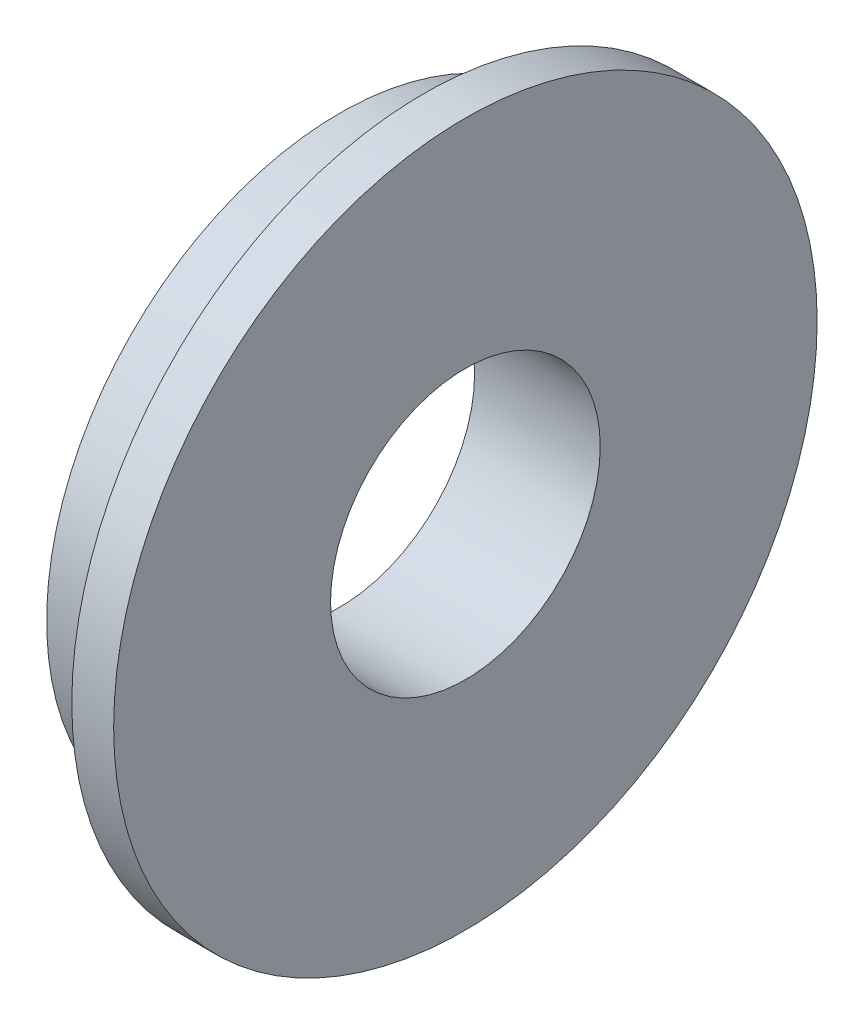
ISO-10303-21;
HEADER;
FILE_DESCRIPTION(('STEP AP214'),'2;1');
FILE_NAME('part.step','',(''),(''),'','','');
FILE_SCHEMA(('AUTOMOTIVE_DESIGN { 1 0 10303 214 1 1 1 1 }'));
ENDSEC;
DATA;
#1=APPLICATION_CONTEXT('core data for automotive mechanical design processes');
#2=APPLICATION_PROTOCOL_DEFINITION('international standard','automotive_design',2000,#1);
#3=PRODUCT_CONTEXT('',#1,'mechanical');
#4=PRODUCT('Part','Part','',(#3));
#5=PRODUCT_RELATED_PRODUCT_CATEGORY('part','',(#4));
#6=PRODUCT_DEFINITION_FORMATION('','',#4);
#7=PRODUCT_DEFINITION_CONTEXT('part definition',#1,'design');
#8=PRODUCT_DEFINITION('design','',#6,#7);
#9=PRODUCT_DEFINITION_SHAPE('','',#8);
#10=(LENGTH_UNIT() NAMED_UNIT(*) SI_UNIT(.MILLI.,.METRE.));
#11=(NAMED_UNIT(*) PLANE_ANGLE_UNIT() SI_UNIT($,.RADIAN.));
#12=(NAMED_UNIT(*) SI_UNIT($,.STERADIAN.) SOLID_ANGLE_UNIT());
#13=UNCERTAINTY_MEASURE_WITH_UNIT(LENGTH_MEASURE(1.E-05),#10,'distance_accuracy_value','');
#14=(GEOMETRIC_REPRESENTATION_CONTEXT(3) GLOBAL_UNCERTAINTY_ASSIGNED_CONTEXT((#13)) GLOBAL_UNIT_ASSIGNED_CONTEXT((#10,
#11,#12)) REPRESENTATION_CONTEXT('',''));
#15=CARTESIAN_POINT('',(0.,0.,0.));
#16=DIRECTION('',(0.,0.,1.));
#17=DIRECTION('',(1.,0.,0.));
#18=AXIS2_PLACEMENT_3D('',#15,#16,#17);
#19=CARTESIAN_POINT('',(0.,0.,0.));
#20=DIRECTION('',(1.,0.,0.));
#21=DIRECTION('',(0.,0.,-1.));
#22=AXIS2_PLACEMENT_3D('',#19,#20,#21);
#23=PLANE('',#22);
#24=CARTESIAN_POINT('',(0.,0.,0.));
#25=DIRECTION('',(1.,0.,0.));
#26=DIRECTION('',(0.,0.,-1.));
#27=AXIS2_PLACEMENT_3D('',#24,#25,#26);
#28=CIRCLE('',#27,4.445);
#29=CARTESIAN_POINT('',(0.,0.,-4.445));
#30=VERTEX_POINT('',#29);
#31=EDGE_CURVE('E49',#30,#30,#28,.T.);
#32=ORIENTED_EDGE('',*,*,#31,.F.);
#33=EDGE_LOOP('',(#32));
#34=FACE_BOUND('',#33,.T.);
#35=CARTESIAN_POINT('',(0.,0.,0.));
#36=DIRECTION('',(1.,0.,0.));
#37=DIRECTION('',(0.,0.,-1.));
#38=AXIS2_PLACEMENT_3D('',#35,#36,#37);
#39=CIRCLE('',#38,2.0447);
#40=CARTESIAN_POINT('',(0.,0.,-2.0447));
#41=VERTEX_POINT('',#40);
#42=EDGE_CURVE('E58',#41,#41,#39,.T.);
#43=ORIENTED_EDGE('',*,*,#42,.T.);
#44=EDGE_LOOP('',(#43));
#45=FACE_BOUND('',#44,.T.);
#46=ADVANCED_FACE('F45',(#34,#45),#23,.F.);
#47=CARTESIAN_POINT('',(1.27,0.,0.));
#48=DIRECTION('',(-1.,0.,0.));
#49=DIRECTION('',(0.,0.,1.));
#50=AXIS2_PLACEMENT_3D('',#47,#48,#49);
#51=CYLINDRICAL_SURFACE('',#50,4.445);
#52=CARTESIAN_POINT('',(1.27,0.,0.));
#53=DIRECTION('',(1.,0.,0.));
#54=DIRECTION('',(0.,0.,-1.));
#55=AXIS2_PLACEMENT_3D('',#52,#53,#54);
#56=CIRCLE('',#55,4.445);
#57=CARTESIAN_POINT('',(1.27,0.,-4.445));
#58=VERTEX_POINT('',#57);
#59=EDGE_CURVE('E10',#58,#58,#56,.T.);
#60=ORIENTED_EDGE('',*,*,#59,.F.);
#61=EDGE_LOOP('',(#60));
#62=FACE_BOUND('',#61,.T.);
#63=ORIENTED_EDGE('',*,*,#31,.T.);
#64=EDGE_LOOP('',(#63));
#65=FACE_BOUND('',#64,.T.);
#66=ADVANCED_FACE('F47',(#62,#65),#51,.T.);
#67=CARTESIAN_POINT('',(1.27,0.,0.));
#68=DIRECTION('',(-1.,0.,0.));
#69=DIRECTION('',(0.,0.,1.));
#70=AXIS2_PLACEMENT_3D('',#67,#68,#69);
#71=CYLINDRICAL_SURFACE('',#70,2.0447);
#72=ORIENTED_EDGE('',*,*,#42,.F.);
#73=EDGE_LOOP('',(#72));
#74=FACE_BOUND('',#73,.T.);
#75=CARTESIAN_POINT('',(1.905,0.,0.));
#76=DIRECTION('',(-1.,0.,0.));
#77=DIRECTION('',(0.,0.,1.));
#78=AXIS2_PLACEMENT_3D('',#75,#76,#77);
#79=CIRCLE('',#78,2.0447);
#80=CARTESIAN_POINT('',(1.905,0.,2.0447));
#81=VERTEX_POINT('',#80);
#82=EDGE_CURVE('E68',#81,#81,#79,.T.);
#83=ORIENTED_EDGE('',*,*,#82,.F.);
#84=EDGE_LOOP('',(#83));
#85=FACE_BOUND('',#84,.T.);
#86=ADVANCED_FACE('F79',(#74,#85),#71,.F.);
#87=CARTESIAN_POINT('',(1.905,0.,0.));
#88=DIRECTION('',(-1.,0.,0.));
#89=DIRECTION('',(0.,0.,1.));
#90=AXIS2_PLACEMENT_3D('',#87,#88,#89);
#91=CYLINDRICAL_SURFACE('',#90,5.334);
#92=CARTESIAN_POINT('',(1.905,0.,0.));
#93=DIRECTION('',(-1.,0.,0.));
#94=DIRECTION('',(0.,0.,1.));
#95=AXIS2_PLACEMENT_3D('',#92,#93,#94);
#96=CIRCLE('',#95,5.334);
#97=CARTESIAN_POINT('',(1.905,0.,5.334));
#98=VERTEX_POINT('',#97);
#99=EDGE_CURVE('E63',#98,#98,#96,.T.);
#100=ORIENTED_EDGE('',*,*,#99,.T.);
#101=EDGE_LOOP('',(#100));
#102=FACE_BOUND('',#101,.T.);
#103=CARTESIAN_POINT('',(1.27,0.,0.));
#104=DIRECTION('',(-1.,0.,0.));
#105=DIRECTION('',(0.,0.,1.));
#106=AXIS2_PLACEMENT_3D('',#103,#104,#105);
#107=CIRCLE('',#106,5.334);
#108=CARTESIAN_POINT('',(1.27,0.,5.334));
#109=VERTEX_POINT('',#108);
#110=EDGE_CURVE('E64',#109,#109,#107,.T.);
#111=ORIENTED_EDGE('',*,*,#110,.F.);
#112=EDGE_LOOP('',(#111));
#113=FACE_BOUND('',#112,.T.);
#114=ADVANCED_FACE('F81',(#102,#113),#91,.T.);
#115=CARTESIAN_POINT('',(1.905,0.,0.));
#116=DIRECTION('',(-1.,0.,0.));
#117=DIRECTION('',(0.,0.,1.));
#118=AXIS2_PLACEMENT_3D('',#115,#116,#117);
#119=PLANE('',#118);
#120=ORIENTED_EDGE('',*,*,#82,.T.);
#121=EDGE_LOOP('',(#120));
#122=FACE_BOUND('',#121,.T.);
#123=ORIENTED_EDGE('',*,*,#99,.F.);
#124=EDGE_LOOP('',(#123));
#125=FACE_BOUND('',#124,.T.);
#126=ADVANCED_FACE('F76',(#122,#125),#119,.F.);
#127=CARTESIAN_POINT('',(1.27,0.,0.));
#128=DIRECTION('',(-1.,0.,0.));
#129=DIRECTION('',(0.,0.,1.));
#130=AXIS2_PLACEMENT_3D('',#127,#128,#129);
#131=PLANE('',#130);
#132=ORIENTED_EDGE('',*,*,#59,.T.);
#133=EDGE_LOOP('',(#132));
#134=FACE_BOUND('',#133,.T.);
#135=ORIENTED_EDGE('',*,*,#110,.T.);
#136=EDGE_LOOP('',(#135));
#137=FACE_BOUND('',#136,.T.);
#138=ADVANCED_FACE('F127',(#134,#137),#131,.T.);
#139=CLOSED_SHELL('',(#46,#66,#86,#114,#126,#138));
#140=MANIFOLD_SOLID_BREP('B2',#139);
#141=ADVANCED_BREP_SHAPE_REPRESENTATION('',(#18,#140),#14);
#142=SHAPE_DEFINITION_REPRESENTATION(#9,#141);
ENDSEC;
END-ISO-10303-21;
